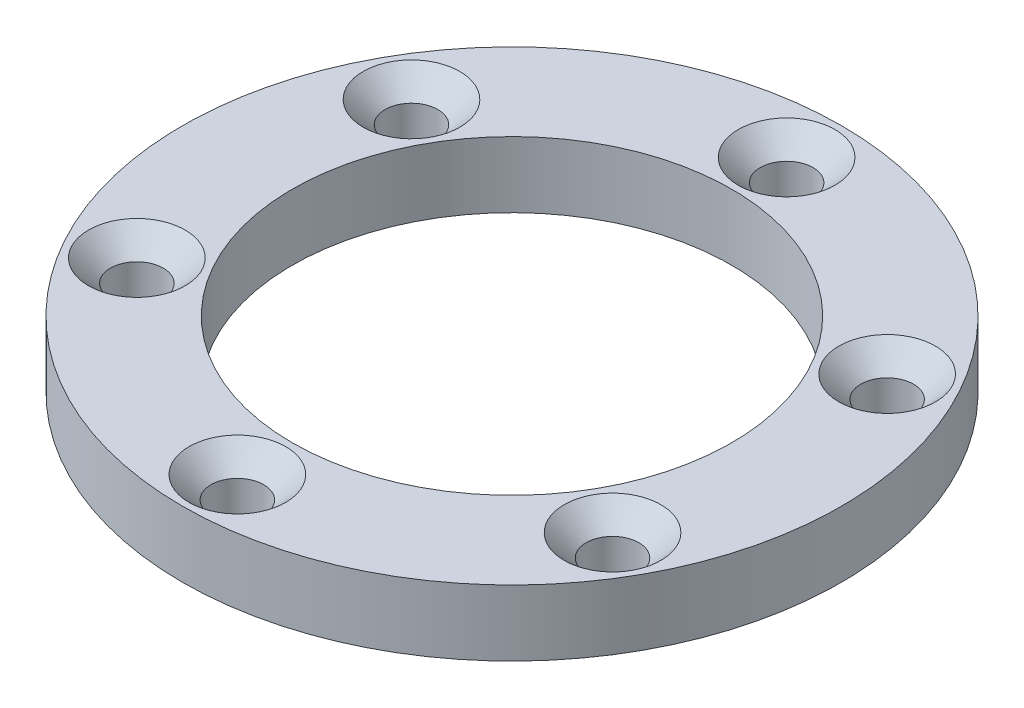
ISO-10303-21;
HEADER;
FILE_DESCRIPTION(('STEP AP214'),'2;1');
FILE_NAME('part.step','',(''),(''),'','','');
FILE_SCHEMA(('AUTOMOTIVE_DESIGN { 1 0 10303 214 1 1 1 1 }'));
ENDSEC;
DATA;
#1=APPLICATION_CONTEXT('core data for automotive mechanical design processes');
#2=APPLICATION_PROTOCOL_DEFINITION('international standard','automotive_design',2000,#1);
#3=PRODUCT_CONTEXT('',#1,'mechanical');
#4=PRODUCT('Part','Part','',(#3));
#5=PRODUCT_RELATED_PRODUCT_CATEGORY('part','',(#4));
#6=PRODUCT_DEFINITION_FORMATION('','',#4);
#7=PRODUCT_DEFINITION_CONTEXT('part definition',#1,'design');
#8=PRODUCT_DEFINITION('design','',#6,#7);
#9=PRODUCT_DEFINITION_SHAPE('','',#8);
#10=(LENGTH_UNIT() NAMED_UNIT(*) SI_UNIT(.MILLI.,.METRE.));
#11=(NAMED_UNIT(*) PLANE_ANGLE_UNIT() SI_UNIT($,.RADIAN.));
#12=(NAMED_UNIT(*) SI_UNIT($,.STERADIAN.) SOLID_ANGLE_UNIT());
#13=UNCERTAINTY_MEASURE_WITH_UNIT(LENGTH_MEASURE(1.E-05),#10,'distance_accuracy_value','');
#14=(GEOMETRIC_REPRESENTATION_CONTEXT(3) GLOBAL_UNCERTAINTY_ASSIGNED_CONTEXT((#13)) GLOBAL_UNIT_ASSIGNED_CONTEXT((#10,
#11,#12)) REPRESENTATION_CONTEXT('',''));
#15=CARTESIAN_POINT('',(0.,0.,0.));
#16=DIRECTION('',(0.,0.,1.));
#17=DIRECTION('',(1.,0.,0.));
#18=AXIS2_PLACEMENT_3D('',#15,#16,#17);
#19=CARTESIAN_POINT('',(0.,1.5,0.));
#20=DIRECTION('',(0.,1.,0.));
#21=DIRECTION('',(0.,0.,1.));
#22=AXIS2_PLACEMENT_3D('',#19,#20,#21);
#23=PLANE('',#22);
#24=CARTESIAN_POINT('',(10.8253175473054,1.5,-6.25000000000013));
#25=DIRECTION('',(0.,1.,0.));
#26=DIRECTION('',(0.,0.,1.));
#27=AXIS2_PLACEMENT_3D('',#24,#25,#26);
#28=CIRCLE('',#27,2.2);
#29=CARTESIAN_POINT('',(10.8253175473054,1.5,-4.05000000000013));
#30=VERTEX_POINT('',#29);
#31=EDGE_CURVE('E99',#30,#30,#28,.T.);
#32=ORIENTED_EDGE('',*,*,#31,.F.);
#33=EDGE_LOOP('',(#32));
#34=FACE_BOUND('',#33,.T.);
#35=CARTESIAN_POINT('',(10.8253175473055,1.5,6.2499999999999));
#36=DIRECTION('',(0.,1.,0.));
#37=DIRECTION('',(0.,0.,1.));
#38=AXIS2_PLACEMENT_3D('',#35,#36,#37);
#39=CIRCLE('',#38,2.2);
#40=CARTESIAN_POINT('',(10.8253175473055,1.5,8.4499999999999));
#41=VERTEX_POINT('',#40);
#42=EDGE_CURVE('E90',#41,#41,#39,.T.);
#43=ORIENTED_EDGE('',*,*,#42,.F.);
#44=EDGE_LOOP('',(#43));
#45=FACE_BOUND('',#44,.T.);
#46=CARTESIAN_POINT('',(0.,1.5,12.5));
#47=DIRECTION('',(0.,1.,0.));
#48=DIRECTION('',(0.,0.,1.));
#49=AXIS2_PLACEMENT_3D('',#46,#47,#48);
#50=CIRCLE('',#49,2.2);
#51=CARTESIAN_POINT('',(0.,1.5,14.7));
#52=VERTEX_POINT('',#51);
#53=EDGE_CURVE('E81',#52,#52,#50,.T.);
#54=ORIENTED_EDGE('',*,*,#53,.F.);
#55=EDGE_LOOP('',(#54));
#56=FACE_BOUND('',#55,.T.);
#57=CARTESIAN_POINT('',(-10.8253175473055,1.5,6.25000000000005));
#58=DIRECTION('',(0.,1.,0.));
#59=DIRECTION('',(0.,0.,1.));
#60=AXIS2_PLACEMENT_3D('',#57,#58,#59);
#61=CIRCLE('',#60,2.2);
#62=CARTESIAN_POINT('',(-10.8253175473055,1.5,8.45000000000005));
#63=VERTEX_POINT('',#62);
#64=EDGE_CURVE('E72',#63,#63,#61,.T.);
#65=ORIENTED_EDGE('',*,*,#64,.F.);
#66=EDGE_LOOP('',(#65));
#67=FACE_BOUND('',#66,.T.);
#68=CARTESIAN_POINT('',(-10.8253175473055,1.5,-6.24999999999998));
#69=DIRECTION('',(0.,1.,0.));
#70=DIRECTION('',(0.,0.,1.));
#71=AXIS2_PLACEMENT_3D('',#68,#69,#70);
#72=CIRCLE('',#71,2.2);
#73=CARTESIAN_POINT('',(-10.8253175473055,1.5,-4.04999999999997));
#74=VERTEX_POINT('',#73);
#75=EDGE_CURVE('E63',#74,#74,#72,.T.);
#76=ORIENTED_EDGE('',*,*,#75,.F.);
#77=EDGE_LOOP('',(#76));
#78=FACE_BOUND('',#77,.T.);
#79=CARTESIAN_POINT('',(0.,1.5,-12.5));
#80=DIRECTION('',(0.,1.,0.));
#81=DIRECTION('',(0.,0.,1.));
#82=AXIS2_PLACEMENT_3D('',#79,#80,#81);
#83=CIRCLE('',#82,2.2);
#84=CARTESIAN_POINT('',(0.,1.5,-10.3));
#85=VERTEX_POINT('',#84);
#86=EDGE_CURVE('E54',#85,#85,#83,.T.);
#87=ORIENTED_EDGE('',*,*,#86,.F.);
#88=EDGE_LOOP('',(#87));
#89=FACE_BOUND('',#88,.T.);
#90=CARTESIAN_POINT('',(0.,1.5,0.));
#91=DIRECTION('',(0.,1.,0.));
#92=DIRECTION('',(0.,0.,1.));
#93=AXIS2_PLACEMENT_3D('',#90,#91,#92);
#94=CIRCLE('',#93,15.);
#95=CARTESIAN_POINT('',(0.,1.5,15.));
#96=VERTEX_POINT('',#95);
#97=EDGE_CURVE('E10',#96,#96,#94,.T.);
#98=ORIENTED_EDGE('',*,*,#97,.T.);
#99=EDGE_LOOP('',(#98));
#100=FACE_BOUND('',#99,.T.);
#101=CARTESIAN_POINT('',(0.,1.5,0.));
#102=DIRECTION('',(0.,1.,0.));
#103=DIRECTION('',(0.,0.,1.));
#104=AXIS2_PLACEMENT_3D('',#101,#102,#103);
#105=CIRCLE('',#104,10.);
#106=CARTESIAN_POINT('',(0.,1.5,10.));
#107=VERTEX_POINT('',#106);
#108=EDGE_CURVE('E41',#107,#107,#105,.T.);
#109=ORIENTED_EDGE('',*,*,#108,.F.);
#110=EDGE_LOOP('',(#109));
#111=FACE_BOUND('',#110,.T.);
#112=ADVANCED_FACE('F30',(#34,#45,#56,#67,#78,#89,#100,#111),#23,.T.);
#113=CARTESIAN_POINT('',(0.,-1.5,0.));
#114=DIRECTION('',(0.,1.,0.));
#115=DIRECTION('',(0.,0.,1.));
#116=AXIS2_PLACEMENT_3D('',#113,#114,#115);
#117=PLANE('',#116);
#118=CARTESIAN_POINT('',(10.8253175473054,-1.5,-6.25000000000013));
#119=DIRECTION('',(0.,1.,0.));
#120=DIRECTION('',(0.,0.,1.));
#121=AXIS2_PLACEMENT_3D('',#118,#119,#120);
#122=CIRCLE('',#121,1.2);
#123=CARTESIAN_POINT('',(10.8253175473054,-1.5,-5.05000000000013));
#124=VERTEX_POINT('',#123);
#125=EDGE_CURVE('E93',#124,#124,#122,.T.);
#126=ORIENTED_EDGE('',*,*,#125,.T.);
#127=EDGE_LOOP('',(#126));
#128=FACE_BOUND('',#127,.T.);
#129=CARTESIAN_POINT('',(10.8253175473055,-1.5,6.2499999999999));
#130=DIRECTION('',(0.,1.,0.));
#131=DIRECTION('',(0.,0.,1.));
#132=AXIS2_PLACEMENT_3D('',#129,#130,#131);
#133=CIRCLE('',#132,1.2);
#134=CARTESIAN_POINT('',(10.8253175473055,-1.5,7.4499999999999));
#135=VERTEX_POINT('',#134);
#136=EDGE_CURVE('E84',#135,#135,#133,.T.);
#137=ORIENTED_EDGE('',*,*,#136,.T.);
#138=EDGE_LOOP('',(#137));
#139=FACE_BOUND('',#138,.T.);
#140=CARTESIAN_POINT('',(0.,-1.5,12.5));
#141=DIRECTION('',(0.,1.,0.));
#142=DIRECTION('',(0.,0.,1.));
#143=AXIS2_PLACEMENT_3D('',#140,#141,#142);
#144=CIRCLE('',#143,1.2);
#145=CARTESIAN_POINT('',(0.,-1.5,13.7));
#146=VERTEX_POINT('',#145);
#147=EDGE_CURVE('E75',#146,#146,#144,.T.);
#148=ORIENTED_EDGE('',*,*,#147,.T.);
#149=EDGE_LOOP('',(#148));
#150=FACE_BOUND('',#149,.T.);
#151=CARTESIAN_POINT('',(-10.8253175473055,-1.5,6.25000000000005));
#152=DIRECTION('',(0.,1.,0.));
#153=DIRECTION('',(0.,0.,1.));
#154=AXIS2_PLACEMENT_3D('',#151,#152,#153);
#155=CIRCLE('',#154,1.2);
#156=CARTESIAN_POINT('',(-10.8253175473055,-1.5,7.45000000000005));
#157=VERTEX_POINT('',#156);
#158=EDGE_CURVE('E66',#157,#157,#155,.T.);
#159=ORIENTED_EDGE('',*,*,#158,.T.);
#160=EDGE_LOOP('',(#159));
#161=FACE_BOUND('',#160,.T.);
#162=CARTESIAN_POINT('',(-10.8253175473055,-1.5,-6.24999999999998));
#163=DIRECTION('',(0.,1.,0.));
#164=DIRECTION('',(0.,0.,1.));
#165=AXIS2_PLACEMENT_3D('',#162,#163,#164);
#166=CIRCLE('',#165,1.2);
#167=CARTESIAN_POINT('',(-10.8253175473055,-1.5,-5.04999999999998));
#168=VERTEX_POINT('',#167);
#169=EDGE_CURVE('E57',#168,#168,#166,.T.);
#170=ORIENTED_EDGE('',*,*,#169,.T.);
#171=EDGE_LOOP('',(#170));
#172=FACE_BOUND('',#171,.T.);
#173=CARTESIAN_POINT('',(0.,-1.5,-12.5));
#174=DIRECTION('',(0.,1.,0.));
#175=DIRECTION('',(0.,0.,1.));
#176=AXIS2_PLACEMENT_3D('',#173,#174,#175);
#177=CIRCLE('',#176,1.2);
#178=CARTESIAN_POINT('',(0.,-1.5,-11.3));
#179=VERTEX_POINT('',#178);
#180=EDGE_CURVE('E46',#179,#179,#177,.T.);
#181=ORIENTED_EDGE('',*,*,#180,.T.);
#182=EDGE_LOOP('',(#181));
#183=FACE_BOUND('',#182,.T.);
#184=CARTESIAN_POINT('',(0.,-1.5,0.));
#185=DIRECTION('',(0.,1.,0.));
#186=DIRECTION('',(0.,0.,1.));
#187=AXIS2_PLACEMENT_3D('',#184,#185,#186);
#188=CIRCLE('',#187,15.);
#189=CARTESIAN_POINT('',(0.,-1.5,15.));
#190=VERTEX_POINT('',#189);
#191=EDGE_CURVE('E34',#190,#190,#188,.T.);
#192=ORIENTED_EDGE('',*,*,#191,.F.);
#193=EDGE_LOOP('',(#192));
#194=FACE_BOUND('',#193,.T.);
#195=CARTESIAN_POINT('',(0.,-1.5,0.));
#196=DIRECTION('',(0.,1.,0.));
#197=DIRECTION('',(0.,0.,1.));
#198=AXIS2_PLACEMENT_3D('',#195,#196,#197);
#199=CIRCLE('',#198,10.);
#200=CARTESIAN_POINT('',(0.,-1.5,10.));
#201=VERTEX_POINT('',#200);
#202=EDGE_CURVE('E43',#201,#201,#199,.T.);
#203=ORIENTED_EDGE('',*,*,#202,.T.);
#204=EDGE_LOOP('',(#203));
#205=FACE_BOUND('',#204,.T.);
#206=ADVANCED_FACE('F107',(#128,#139,#150,#161,#172,#183,#194,#205),#117,.F.);
#207=CARTESIAN_POINT('',(0.,1.5,0.));
#208=DIRECTION('',(0.,-1.,0.));
#209=DIRECTION('',(0.,0.,-1.));
#210=AXIS2_PLACEMENT_3D('',#207,#208,#209);
#211=CYLINDRICAL_SURFACE('',#210,15.);
#212=ORIENTED_EDGE('',*,*,#97,.F.);
#213=EDGE_LOOP('',(#212));
#214=FACE_BOUND('',#213,.T.);
#215=ORIENTED_EDGE('',*,*,#191,.T.);
#216=EDGE_LOOP('',(#215));
#217=FACE_BOUND('',#216,.T.);
#218=ADVANCED_FACE('F32',(#214,#217),#211,.T.);
#219=CARTESIAN_POINT('',(0.,1.5,0.));
#220=DIRECTION('',(0.,-1.,0.));
#221=DIRECTION('',(0.,0.,-1.));
#222=AXIS2_PLACEMENT_3D('',#219,#220,#221);
#223=CYLINDRICAL_SURFACE('',#222,10.);
#224=ORIENTED_EDGE('',*,*,#108,.T.);
#225=EDGE_LOOP('',(#224));
#226=FACE_BOUND('',#225,.T.);
#227=ORIENTED_EDGE('',*,*,#202,.F.);
#228=EDGE_LOOP('',(#227));
#229=FACE_BOUND('',#228,.T.);
#230=ADVANCED_FACE('F121',(#226,#229),#223,.F.);
#231=CARTESIAN_POINT('',(0.,1.5,-12.5));
#232=DIRECTION('',(0.,1.,0.));
#233=DIRECTION('',(0.,0.,1.));
#234=AXIS2_PLACEMENT_3D('',#231,#232,#233);
#235=CYLINDRICAL_SURFACE('',#234,1.2);
#236=ORIENTED_EDGE('',*,*,#180,.F.);
#237=EDGE_LOOP('',(#236));
#238=FACE_BOUND('',#237,.T.);
#239=CARTESIAN_POINT('',(0.,0.499999999999999,-12.5));
#240=DIRECTION('',(0.,1.,0.));
#241=DIRECTION('',(0.,0.,1.));
#242=AXIS2_PLACEMENT_3D('',#239,#240,#241);
#243=CIRCLE('',#242,1.2);
#244=CARTESIAN_POINT('',(0.,0.499999999999999,-11.3));
#245=VERTEX_POINT('',#244);
#246=EDGE_CURVE('E51',#245,#245,#243,.T.);
#247=ORIENTED_EDGE('',*,*,#246,.T.);
#248=EDGE_LOOP('',(#247));
#249=FACE_BOUND('',#248,.T.);
#250=ADVANCED_FACE('F124',(#238,#249),#235,.F.);
#251=CARTESIAN_POINT('',(0.,1.5,-12.5));
#252=DIRECTION('',(0.,1.,0.));
#253=DIRECTION('',(0.,0.,1.));
#254=AXIS2_PLACEMENT_3D('',#251,#252,#253);
#255=CONICAL_SURFACE('',#254,2.2,0.785398163397448);
#256=ORIENTED_EDGE('',*,*,#246,.F.);
#257=EDGE_LOOP('',(#256));
#258=FACE_BOUND('',#257,.T.);
#259=ORIENTED_EDGE('',*,*,#86,.T.);
#260=EDGE_LOOP('',(#259));
#261=FACE_BOUND('',#260,.T.);
#262=ADVANCED_FACE('F138',(#258,#261),#255,.F.);
#263=CARTESIAN_POINT('',(-10.8253175473055,1.5,-6.24999999999998));
#264=DIRECTION('',(0.,1.,0.));
#265=DIRECTION('',(0.,0.,1.));
#266=AXIS2_PLACEMENT_3D('',#263,#264,#265);
#267=CYLINDRICAL_SURFACE('',#266,1.2);
#268=ORIENTED_EDGE('',*,*,#169,.F.);
#269=EDGE_LOOP('',(#268));
#270=FACE_BOUND('',#269,.T.);
#271=CARTESIAN_POINT('',(-10.8253175473055,0.499999999999999,-6.24999999999998));
#272=DIRECTION('',(0.,1.,0.));
#273=DIRECTION('',(0.,0.,1.));
#274=AXIS2_PLACEMENT_3D('',#271,#272,#273);
#275=CIRCLE('',#274,1.2);
#276=CARTESIAN_POINT('',(-10.8253175473055,0.499999999999999,-5.04999999999998));
#277=VERTEX_POINT('',#276);
#278=EDGE_CURVE('E60',#277,#277,#275,.T.);
#279=ORIENTED_EDGE('',*,*,#278,.T.);
#280=EDGE_LOOP('',(#279));
#281=FACE_BOUND('',#280,.T.);
#282=ADVANCED_FACE('F142',(#270,#281),#267,.F.);
#283=CARTESIAN_POINT('',(-10.8253175473055,1.5,-6.24999999999998));
#284=DIRECTION('',(0.,1.,0.));
#285=DIRECTION('',(0.,0.,1.));
#286=AXIS2_PLACEMENT_3D('',#283,#284,#285);
#287=CONICAL_SURFACE('',#286,2.2,0.785398163397448);
#288=ORIENTED_EDGE('',*,*,#278,.F.);
#289=EDGE_LOOP('',(#288));
#290=FACE_BOUND('',#289,.T.);
#291=ORIENTED_EDGE('',*,*,#75,.T.);
#292=EDGE_LOOP('',(#291));
#293=FACE_BOUND('',#292,.T.);
#294=ADVANCED_FACE('F146',(#290,#293),#287,.F.);
#295=CARTESIAN_POINT('',(-10.8253175473055,1.5,6.25000000000005));
#296=DIRECTION('',(0.,1.,0.));
#297=DIRECTION('',(0.,0.,1.));
#298=AXIS2_PLACEMENT_3D('',#295,#296,#297);
#299=CYLINDRICAL_SURFACE('',#298,1.2);
#300=ORIENTED_EDGE('',*,*,#158,.F.);
#301=EDGE_LOOP('',(#300));
#302=FACE_BOUND('',#301,.T.);
#303=CARTESIAN_POINT('',(-10.8253175473055,0.499999999999999,6.25000000000005));
#304=DIRECTION('',(0.,1.,0.));
#305=DIRECTION('',(0.,0.,1.));
#306=AXIS2_PLACEMENT_3D('',#303,#304,#305);
#307=CIRCLE('',#306,1.2);
#308=CARTESIAN_POINT('',(-10.8253175473055,0.499999999999999,7.45000000000005));
#309=VERTEX_POINT('',#308);
#310=EDGE_CURVE('E69',#309,#309,#307,.T.);
#311=ORIENTED_EDGE('',*,*,#310,.T.);
#312=EDGE_LOOP('',(#311));
#313=FACE_BOUND('',#312,.T.);
#314=ADVANCED_FACE('F150',(#302,#313),#299,.F.);
#315=CARTESIAN_POINT('',(-10.8253175473055,1.5,6.25000000000005));
#316=DIRECTION('',(0.,1.,0.));
#317=DIRECTION('',(0.,0.,1.));
#318=AXIS2_PLACEMENT_3D('',#315,#316,#317);
#319=CONICAL_SURFACE('',#318,2.2,0.785398163397448);
#320=ORIENTED_EDGE('',*,*,#310,.F.);
#321=EDGE_LOOP('',(#320));
#322=FACE_BOUND('',#321,.T.);
#323=ORIENTED_EDGE('',*,*,#64,.T.);
#324=EDGE_LOOP('',(#323));
#325=FACE_BOUND('',#324,.T.);
#326=ADVANCED_FACE('F154',(#322,#325),#319,.F.);
#327=CARTESIAN_POINT('',(0.,1.5,12.5));
#328=DIRECTION('',(0.,1.,0.));
#329=DIRECTION('',(0.,0.,1.));
#330=AXIS2_PLACEMENT_3D('',#327,#328,#329);
#331=CYLINDRICAL_SURFACE('',#330,1.2);
#332=ORIENTED_EDGE('',*,*,#147,.F.);
#333=EDGE_LOOP('',(#332));
#334=FACE_BOUND('',#333,.T.);
#335=CARTESIAN_POINT('',(0.,0.499999999999999,12.5));
#336=DIRECTION('',(0.,1.,0.));
#337=DIRECTION('',(0.,0.,1.));
#338=AXIS2_PLACEMENT_3D('',#335,#336,#337);
#339=CIRCLE('',#338,1.2);
#340=CARTESIAN_POINT('',(0.,0.499999999999999,13.7));
#341=VERTEX_POINT('',#340);
#342=EDGE_CURVE('E78',#341,#341,#339,.T.);
#343=ORIENTED_EDGE('',*,*,#342,.T.);
#344=EDGE_LOOP('',(#343));
#345=FACE_BOUND('',#344,.T.);
#346=ADVANCED_FACE('F158',(#334,#345),#331,.F.);
#347=CARTESIAN_POINT('',(0.,1.5,12.5));
#348=DIRECTION('',(0.,1.,0.));
#349=DIRECTION('',(0.,0.,1.));
#350=AXIS2_PLACEMENT_3D('',#347,#348,#349);
#351=CONICAL_SURFACE('',#350,2.2,0.785398163397448);
#352=ORIENTED_EDGE('',*,*,#342,.F.);
#353=EDGE_LOOP('',(#352));
#354=FACE_BOUND('',#353,.T.);
#355=ORIENTED_EDGE('',*,*,#53,.T.);
#356=EDGE_LOOP('',(#355));
#357=FACE_BOUND('',#356,.T.);
#358=ADVANCED_FACE('F162',(#354,#357),#351,.F.);
#359=CARTESIAN_POINT('',(10.8253175473055,1.5,6.2499999999999));
#360=DIRECTION('',(0.,1.,0.));
#361=DIRECTION('',(0.,0.,1.));
#362=AXIS2_PLACEMENT_3D('',#359,#360,#361);
#363=CYLINDRICAL_SURFACE('',#362,1.2);
#364=ORIENTED_EDGE('',*,*,#136,.F.);
#365=EDGE_LOOP('',(#364));
#366=FACE_BOUND('',#365,.T.);
#367=CARTESIAN_POINT('',(10.8253175473055,0.499999999999999,6.2499999999999));
#368=DIRECTION('',(0.,1.,0.));
#369=DIRECTION('',(0.,0.,1.));
#370=AXIS2_PLACEMENT_3D('',#367,#368,#369);
#371=CIRCLE('',#370,1.2);
#372=CARTESIAN_POINT('',(10.8253175473055,0.499999999999999,7.4499999999999));
#373=VERTEX_POINT('',#372);
#374=EDGE_CURVE('E87',#373,#373,#371,.T.);
#375=ORIENTED_EDGE('',*,*,#374,.T.);
#376=EDGE_LOOP('',(#375));
#377=FACE_BOUND('',#376,.T.);
#378=ADVANCED_FACE('F166',(#366,#377),#363,.F.);
#379=CARTESIAN_POINT('',(10.8253175473055,1.5,6.2499999999999));
#380=DIRECTION('',(0.,1.,0.));
#381=DIRECTION('',(0.,0.,1.));
#382=AXIS2_PLACEMENT_3D('',#379,#380,#381);
#383=CONICAL_SURFACE('',#382,2.2,0.785398163397448);
#384=ORIENTED_EDGE('',*,*,#374,.F.);
#385=EDGE_LOOP('',(#384));
#386=FACE_BOUND('',#385,.T.);
#387=ORIENTED_EDGE('',*,*,#42,.T.);
#388=EDGE_LOOP('',(#387));
#389=FACE_BOUND('',#388,.T.);
#390=ADVANCED_FACE('F170',(#386,#389),#383,.F.);
#391=CARTESIAN_POINT('',(10.8253175473054,1.5,-6.25000000000013));
#392=DIRECTION('',(0.,1.,0.));
#393=DIRECTION('',(0.,0.,1.));
#394=AXIS2_PLACEMENT_3D('',#391,#392,#393);
#395=CYLINDRICAL_SURFACE('',#394,1.2);
#396=ORIENTED_EDGE('',*,*,#125,.F.);
#397=EDGE_LOOP('',(#396));
#398=FACE_BOUND('',#397,.T.);
#399=CARTESIAN_POINT('',(10.8253175473054,0.499999999999999,-6.25000000000013));
#400=DIRECTION('',(0.,1.,0.));
#401=DIRECTION('',(0.,0.,1.));
#402=AXIS2_PLACEMENT_3D('',#399,#400,#401);
#403=CIRCLE('',#402,1.2);
#404=CARTESIAN_POINT('',(10.8253175473054,0.499999999999999,-5.05000000000013));
#405=VERTEX_POINT('',#404);
#406=EDGE_CURVE('E96',#405,#405,#403,.T.);
#407=ORIENTED_EDGE('',*,*,#406,.T.);
#408=EDGE_LOOP('',(#407));
#409=FACE_BOUND('',#408,.T.);
#410=ADVANCED_FACE('F174',(#398,#409),#395,.F.);
#411=CARTESIAN_POINT('',(10.8253175473054,1.5,-6.25000000000013));
#412=DIRECTION('',(0.,1.,0.));
#413=DIRECTION('',(0.,0.,1.));
#414=AXIS2_PLACEMENT_3D('',#411,#412,#413);
#415=CONICAL_SURFACE('',#414,2.2,0.785398163397448);
#416=ORIENTED_EDGE('',*,*,#406,.F.);
#417=EDGE_LOOP('',(#416));
#418=FACE_BOUND('',#417,.T.);
#419=ORIENTED_EDGE('',*,*,#31,.T.);
#420=EDGE_LOOP('',(#419));
#421=FACE_BOUND('',#420,.T.);
#422=ADVANCED_FACE('F103',(#418,#421),#415,.F.);
#423=CLOSED_SHELL('',(#112,#206,#218,#230,#250,#262,#282,#294,#314,#326,#346,#358,#378,#390,
#410,#422));
#424=MANIFOLD_SOLID_BREP('B2',#423);
#425=ADVANCED_BREP_SHAPE_REPRESENTATION('',(#18,#424),#14);
#426=SHAPE_DEFINITION_REPRESENTATION(#9,#425);
ENDSEC;
END-ISO-10303-21;
